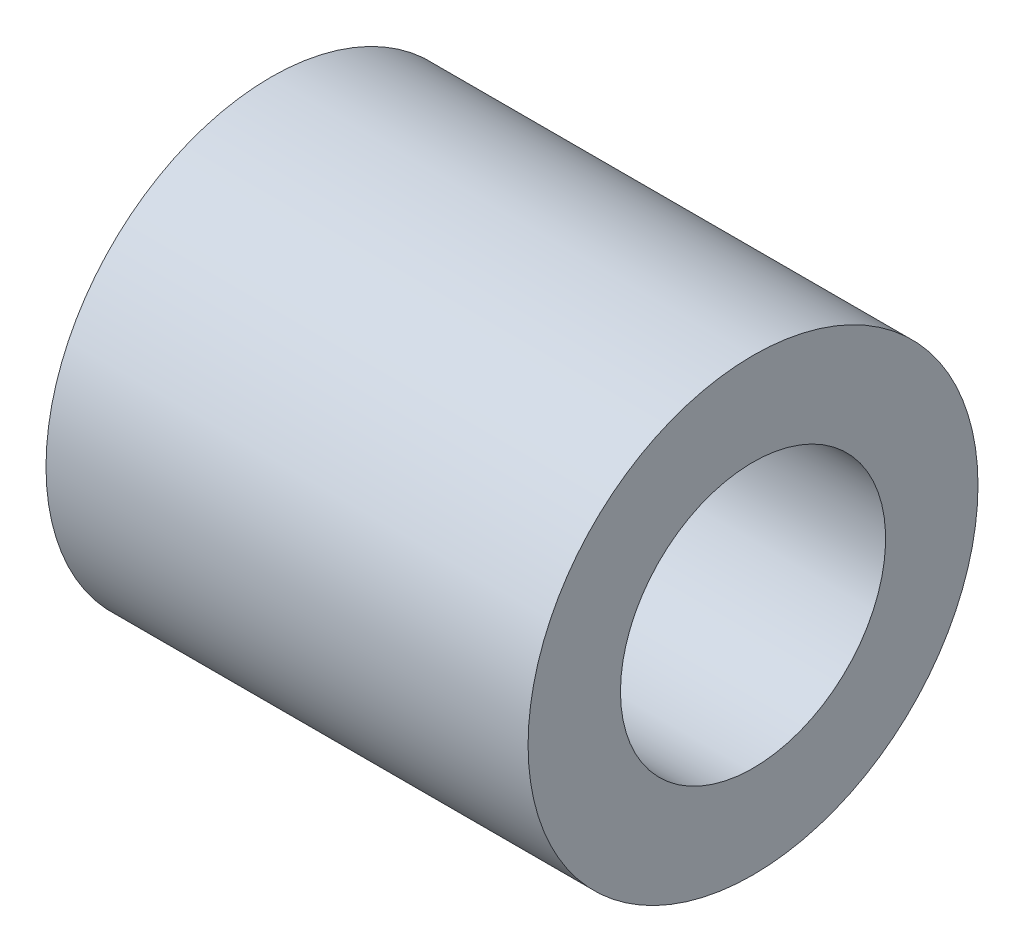
ISO-10303-21;
HEADER;
FILE_DESCRIPTION(('STEP AP214'),'2;1');
FILE_NAME('part.step','',(''),(''),'','','');
FILE_SCHEMA(('AUTOMOTIVE_DESIGN { 1 0 10303 214 1 1 1 1 }'));
ENDSEC;
DATA;
#1=APPLICATION_CONTEXT('core data for automotive mechanical design processes');
#2=APPLICATION_PROTOCOL_DEFINITION('international standard','automotive_design',2000,#1);
#3=PRODUCT_CONTEXT('',#1,'mechanical');
#4=PRODUCT('Part','Part','',(#3));
#5=PRODUCT_RELATED_PRODUCT_CATEGORY('part','',(#4));
#6=PRODUCT_DEFINITION_FORMATION('','',#4);
#7=PRODUCT_DEFINITION_CONTEXT('part definition',#1,'design');
#8=PRODUCT_DEFINITION('design','',#6,#7);
#9=PRODUCT_DEFINITION_SHAPE('','',#8);
#10=(LENGTH_UNIT() NAMED_UNIT(*) SI_UNIT(.MILLI.,.METRE.));
#11=(NAMED_UNIT(*) PLANE_ANGLE_UNIT() SI_UNIT($,.RADIAN.));
#12=(NAMED_UNIT(*) SI_UNIT($,.STERADIAN.) SOLID_ANGLE_UNIT());
#13=UNCERTAINTY_MEASURE_WITH_UNIT(LENGTH_MEASURE(1.E-05),#10,'distance_accuracy_value','');
#14=(GEOMETRIC_REPRESENTATION_CONTEXT(3) GLOBAL_UNCERTAINTY_ASSIGNED_CONTEXT((#13)) GLOBAL_UNIT_ASSIGNED_CONTEXT((#10,
#11,#12)) REPRESENTATION_CONTEXT('',''));
#15=CARTESIAN_POINT('',(0.,0.,0.));
#16=DIRECTION('',(0.,0.,1.));
#17=DIRECTION('',(1.,0.,0.));
#18=AXIS2_PLACEMENT_3D('',#15,#16,#17);
#19=CARTESIAN_POINT('',(0.,2.8,0.));
#20=DIRECTION('',(1.,0.,0.));
#21=DIRECTION('',(0.,0.,-1.));
#22=AXIS2_PLACEMENT_3D('',#19,#20,#21);
#23=PLANE('',#22);
#24=CARTESIAN_POINT('',(0.,0.,0.));
#25=DIRECTION('',(-1.,0.,0.));
#26=DIRECTION('',(0.,0.,1.));
#27=AXIS2_PLACEMENT_3D('',#24,#25,#26);
#28=CIRCLE('',#27,1.65);
#29=CARTESIAN_POINT('',(0.,0.,1.65));
#30=VERTEX_POINT('',#29);
#31=EDGE_CURVE('E10',#30,#30,#28,.T.);
#32=ORIENTED_EDGE('',*,*,#31,.F.);
#33=EDGE_LOOP('',(#32));
#34=FACE_BOUND('',#33,.T.);
#35=CARTESIAN_POINT('',(0.,0.,0.));
#36=DIRECTION('',(-1.,0.,0.));
#37=DIRECTION('',(0.,0.,1.));
#38=AXIS2_PLACEMENT_3D('',#35,#36,#37);
#39=CIRCLE('',#38,2.8);
#40=CARTESIAN_POINT('',(0.,0.,2.8));
#41=VERTEX_POINT('',#40);
#42=EDGE_CURVE('E52',#41,#41,#39,.T.);
#43=ORIENTED_EDGE('',*,*,#42,.T.);
#44=EDGE_LOOP('',(#43));
#45=FACE_BOUND('',#44,.T.);
#46=ADVANCED_FACE('F39',(#34,#45),#23,.F.);
#47=CARTESIAN_POINT('',(-400.,0.,0.));
#48=DIRECTION('',(-1.,0.,0.));
#49=DIRECTION('',(0.,0.,1.));
#50=AXIS2_PLACEMENT_3D('',#47,#48,#49);
#51=CYLINDRICAL_SURFACE('',#50,1.65);
#52=CARTESIAN_POINT('',(6.00000000000001,0.,0.));
#53=DIRECTION('',(-1.,0.,0.));
#54=DIRECTION('',(0.,0.,1.));
#55=AXIS2_PLACEMENT_3D('',#52,#53,#54);
#56=CIRCLE('',#55,1.65);
#57=CARTESIAN_POINT('',(6.00000000000001,0.,1.65));
#58=VERTEX_POINT('',#57);
#59=EDGE_CURVE('E44',#58,#58,#56,.T.);
#60=ORIENTED_EDGE('',*,*,#59,.F.);
#61=EDGE_LOOP('',(#60));
#62=FACE_BOUND('',#61,.T.);
#63=ORIENTED_EDGE('',*,*,#31,.T.);
#64=EDGE_LOOP('',(#63));
#65=FACE_BOUND('',#64,.T.);
#66=ADVANCED_FACE('F66',(#62,#65),#51,.F.);
#67=CARTESIAN_POINT('',(6.,1.65,0.));
#68=DIRECTION('',(-1.,0.,0.));
#69=DIRECTION('',(0.,0.,1.));
#70=AXIS2_PLACEMENT_3D('',#67,#68,#69);
#71=PLANE('',#70);
#72=CARTESIAN_POINT('',(6.00000000000001,0.,0.));
#73=DIRECTION('',(-1.,0.,0.));
#74=DIRECTION('',(0.,0.,1.));
#75=AXIS2_PLACEMENT_3D('',#72,#73,#74);
#76=CIRCLE('',#75,2.8);
#77=CARTESIAN_POINT('',(6.00000000000001,0.,2.8));
#78=VERTEX_POINT('',#77);
#79=EDGE_CURVE('E47',#78,#78,#76,.T.);
#80=ORIENTED_EDGE('',*,*,#79,.F.);
#81=EDGE_LOOP('',(#80));
#82=FACE_BOUND('',#81,.T.);
#83=ORIENTED_EDGE('',*,*,#59,.T.);
#84=EDGE_LOOP('',(#83));
#85=FACE_BOUND('',#84,.T.);
#86=ADVANCED_FACE('F63',(#82,#85),#71,.F.);
#87=CARTESIAN_POINT('',(-400.,0.,0.));
#88=DIRECTION('',(-1.,0.,0.));
#89=DIRECTION('',(0.,0.,1.));
#90=AXIS2_PLACEMENT_3D('',#87,#88,#89);
#91=CYLINDRICAL_SURFACE('',#90,2.8);
#92=ORIENTED_EDGE('',*,*,#42,.F.);
#93=EDGE_LOOP('',(#92));
#94=FACE_BOUND('',#93,.T.);
#95=ORIENTED_EDGE('',*,*,#79,.T.);
#96=EDGE_LOOP('',(#95));
#97=FACE_BOUND('',#96,.T.);
#98=ADVANCED_FACE('F58',(#94,#97),#91,.T.);
#99=CLOSED_SHELL('',(#46,#66,#86,#98));
#100=MANIFOLD_SOLID_BREP('B2',#99);
#101=ADVANCED_BREP_SHAPE_REPRESENTATION('',(#18,#100),#14);
#102=SHAPE_DEFINITION_REPRESENTATION(#9,#101);
ENDSEC;
END-ISO-10303-21;
